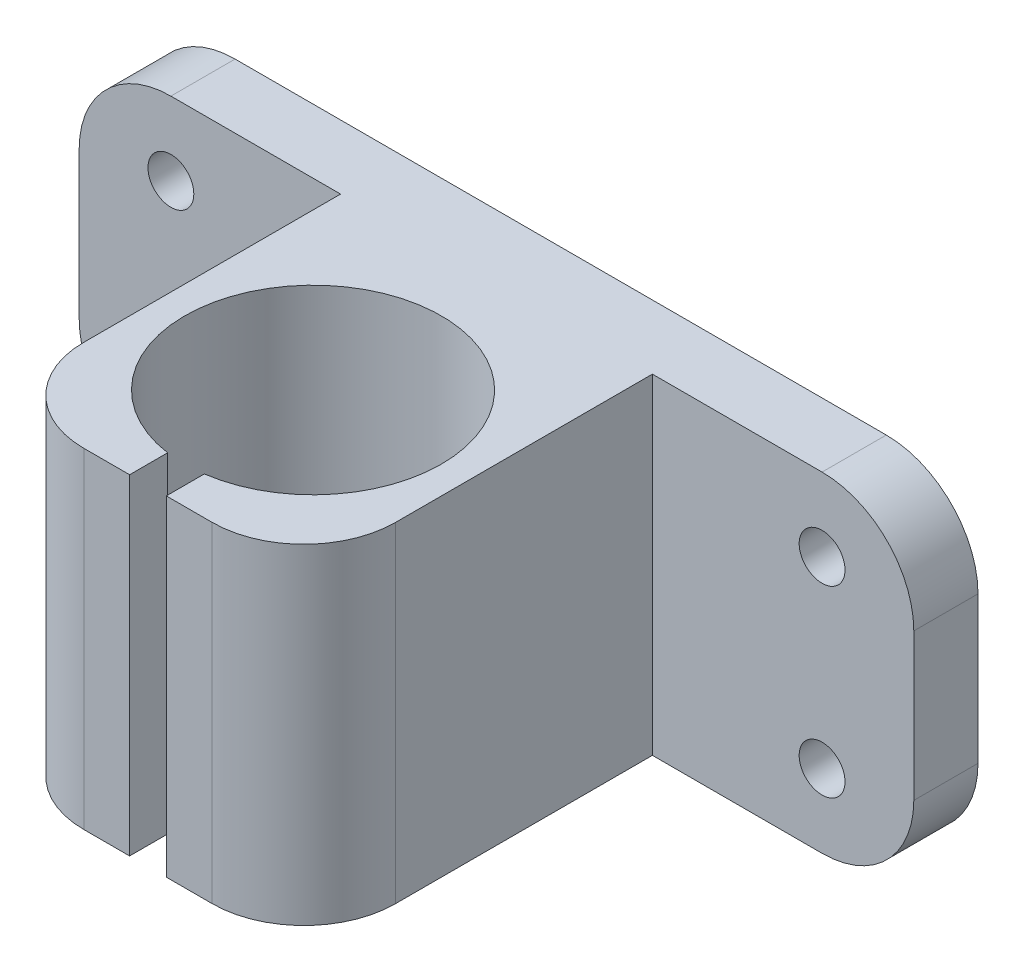
ISO-10303-21;
HEADER;
FILE_DESCRIPTION(('STEP AP214'),'2;1');
FILE_NAME('part.step','',(''),(''),'','','');
FILE_SCHEMA(('AUTOMOTIVE_DESIGN { 1 0 10303 214 1 1 1 1 }'));
ENDSEC;
DATA;
#1=APPLICATION_CONTEXT('core data for automotive mechanical design processes');
#2=APPLICATION_PROTOCOL_DEFINITION('international standard','automotive_design',2000,#1);
#3=PRODUCT_CONTEXT('',#1,'mechanical');
#4=PRODUCT('Part','Part','',(#3));
#5=PRODUCT_RELATED_PRODUCT_CATEGORY('part','',(#4));
#6=PRODUCT_DEFINITION_FORMATION('','',#4);
#7=PRODUCT_DEFINITION_CONTEXT('part definition',#1,'design');
#8=PRODUCT_DEFINITION('design','',#6,#7);
#9=PRODUCT_DEFINITION_SHAPE('','',#8);
#10=(LENGTH_UNIT() NAMED_UNIT(*) SI_UNIT(.MILLI.,.METRE.));
#11=(NAMED_UNIT(*) PLANE_ANGLE_UNIT() SI_UNIT($,.RADIAN.));
#12=(NAMED_UNIT(*) SI_UNIT($,.STERADIAN.) SOLID_ANGLE_UNIT());
#13=UNCERTAINTY_MEASURE_WITH_UNIT(LENGTH_MEASURE(1.E-05),#10,'distance_accuracy_value','');
#14=(GEOMETRIC_REPRESENTATION_CONTEXT(3) GLOBAL_UNCERTAINTY_ASSIGNED_CONTEXT((#13)) GLOBAL_UNIT_ASSIGNED_CONTEXT((#10,
#11,#12)) REPRESENTATION_CONTEXT('',''));
#15=CARTESIAN_POINT('',(0.,0.,0.));
#16=DIRECTION('',(0.,0.,1.));
#17=DIRECTION('',(1.,0.,0.));
#18=AXIS2_PLACEMENT_3D('',#15,#16,#17);
#19=CARTESIAN_POINT('',(0.,0.,45.));
#20=DIRECTION('',(0.,0.,1.));
#21=DIRECTION('',(1.,0.,0.));
#22=AXIS2_PLACEMENT_3D('',#19,#20,#21);
#23=PLANE('',#22);
#24=DIRECTION('',(-1.,0.,0.));
#25=VECTOR('',#24,1.);
#26=CARTESIAN_POINT('',(17.,18.,45.));
#27=LINE('',#26,#25);
#28=CARTESIAN_POINT('',(-2.,18.,45.));
#29=VERTEX_POINT('',#28);
#30=CARTESIAN_POINT('',(-7.,18.,45.));
#31=VERTEX_POINT('',#30);
#32=EDGE_CURVE('E171',#29,#31,#27,.T.);
#33=ORIENTED_EDGE('',*,*,#32,.T.);
#34=DIRECTION('',(0.,1.,0.));
#35=VECTOR('',#34,1.);
#36=CARTESIAN_POINT('',(-7.,0.,45.));
#37=LINE('',#36,#35);
#38=CARTESIAN_POINT('',(-7.,-18.,45.));
#39=VERTEX_POINT('',#38);
#40=EDGE_CURVE('E11',#31,#39,#37,.F.);
#41=ORIENTED_EDGE('',*,*,#40,.T.);
#42=DIRECTION('',(-1.,0.,0.));
#43=VECTOR('',#42,1.);
#44=CARTESIAN_POINT('',(17.,-18.,45.));
#45=LINE('',#44,#43);
#46=CARTESIAN_POINT('',(-2.,-18.,45.));
#47=VERTEX_POINT('',#46);
#48=EDGE_CURVE('E172',#47,#39,#45,.T.);
#49=ORIENTED_EDGE('',*,*,#48,.F.);
#50=DIRECTION('',(0.,1.,0.));
#51=VECTOR('',#50,1.);
#52=CARTESIAN_POINT('',(-2.,-18.,45.));
#53=LINE('',#52,#51);
#54=EDGE_CURVE('E160',#47,#29,#53,.T.);
#55=ORIENTED_EDGE('',*,*,#54,.T.);
#56=EDGE_LOOP('',(#33,#41,#49,#55));
#57=FACE_BOUND('',#56,.T.);
#58=ADVANCED_FACE('F33',(#57),#23,.T.);
#59=CARTESIAN_POINT('',(-35.5,7.99999999999998,7.));
#60=DIRECTION('',(0.,0.,1.));
#61=DIRECTION('',(1.,0.,0.));
#62=AXIS2_PLACEMENT_3D('',#59,#60,#61);
#63=PLANE('',#62);
#64=CARTESIAN_POINT('',(-35.5,-9.99999999999999,7.));
#65=DIRECTION('',(0.,0.,-1.));
#66=DIRECTION('',(-1.,0.,0.));
#67=AXIS2_PLACEMENT_3D('',#64,#65,#66);
#68=CIRCLE('',#67,2.5);
#69=CARTESIAN_POINT('',(-38.,-9.99999999999999,7.));
#70=VERTEX_POINT('',#69);
#71=EDGE_CURVE('E200',#70,#70,#68,.T.);
#72=ORIENTED_EDGE('',*,*,#71,.T.);
#73=EDGE_LOOP('',(#72));
#74=FACE_BOUND('',#73,.T.);
#75=CARTESIAN_POINT('',(-35.5,9.99999999999999,7.));
#76=DIRECTION('',(0.,0.,1.));
#77=DIRECTION('',(1.,0.,0.));
#78=AXIS2_PLACEMENT_3D('',#75,#76,#77);
#79=CIRCLE('',#78,2.5);
#80=CARTESIAN_POINT('',(-33.,9.99999999999999,7.));
#81=VERTEX_POINT('',#80);
#82=EDGE_CURVE('E204',#81,#81,#79,.T.);
#83=ORIENTED_EDGE('',*,*,#82,.F.);
#84=EDGE_LOOP('',(#83));
#85=FACE_BOUND('',#84,.T.);
#86=DIRECTION('',(-1.,0.,0.));
#87=VECTOR('',#86,1.);
#88=CARTESIAN_POINT('',(35.5,-18.,7.));
#89=LINE('',#88,#87);
#90=CARTESIAN_POINT('',(-17.,-18.,7.));
#91=VERTEX_POINT('',#90);
#92=CARTESIAN_POINT('',(-35.5,-18.,7.));
#93=VERTEX_POINT('',#92);
#94=EDGE_CURVE('E225',#91,#93,#89,.T.);
#95=ORIENTED_EDGE('',*,*,#94,.F.);
#96=DIRECTION('',(0.,1.,0.));
#97=VECTOR('',#96,1.);
#98=CARTESIAN_POINT('',(-17.,-18.,7.));
#99=LINE('',#98,#97);
#100=CARTESIAN_POINT('',(-17.,18.,7.));
#101=VERTEX_POINT('',#100);
#102=EDGE_CURVE('E179',#91,#101,#99,.T.);
#103=ORIENTED_EDGE('',*,*,#102,.T.);
#104=DIRECTION('',(-1.,0.,0.));
#105=VECTOR('',#104,1.);
#106=CARTESIAN_POINT('',(35.5,18.,7.));
#107=LINE('',#106,#105);
#108=CARTESIAN_POINT('',(-35.5,18.,7.));
#109=VERTEX_POINT('',#108);
#110=EDGE_CURVE('E217',#101,#109,#107,.T.);
#111=ORIENTED_EDGE('',*,*,#110,.T.);
#112=CARTESIAN_POINT('',(-35.5,7.99999999999998,7.));
#113=DIRECTION('',(0.,0.,1.));
#114=DIRECTION('',(1.,0.,0.));
#115=AXIS2_PLACEMENT_3D('',#112,#113,#114);
#116=CIRCLE('',#115,10.);
#117=CARTESIAN_POINT('',(-45.5,7.99999999999998,7.));
#118=VERTEX_POINT('',#117);
#119=EDGE_CURVE('E216',#109,#118,#116,.T.);
#120=ORIENTED_EDGE('',*,*,#119,.T.);
#121=DIRECTION('',(0.,1.,0.));
#122=VECTOR('',#121,1.);
#123=CARTESIAN_POINT('',(-45.5,-8.,7.));
#124=LINE('',#123,#122);
#125=CARTESIAN_POINT('',(-45.5,-8.,7.));
#126=VERTEX_POINT('',#125);
#127=EDGE_CURVE('E219',#126,#118,#124,.T.);
#128=ORIENTED_EDGE('',*,*,#127,.F.);
#129=CARTESIAN_POINT('',(-35.5,-8.,7.));
#130=DIRECTION('',(0.,0.,-1.));
#131=DIRECTION('',(-1.,0.,0.));
#132=AXIS2_PLACEMENT_3D('',#129,#130,#131);
#133=CIRCLE('',#132,10.);
#134=EDGE_CURVE('E222',#93,#126,#133,.T.);
#135=ORIENTED_EDGE('',*,*,#134,.F.);
#136=EDGE_LOOP('',(#95,#103,#111,#120,#128,#135));
#137=FACE_BOUND('',#136,.T.);
#138=ADVANCED_FACE('F315',(#74,#85,#137),#63,.T.);
#139=DIRECTION('',(0.,1.,0.));
#140=VECTOR('',#139,1.);
#141=CARTESIAN_POINT('',(17.,-18.,7.));
#142=LINE('',#141,#140);
#143=CARTESIAN_POINT('',(17.,-18.,7.));
#144=VERTEX_POINT('',#143);
#145=CARTESIAN_POINT('',(17.,18.,7.));
#146=VERTEX_POINT('',#145);
#147=EDGE_CURVE('E182',#144,#146,#142,.T.);
#148=ORIENTED_EDGE('',*,*,#147,.F.);
#149=CARTESIAN_POINT('',(35.5,-18.,7.));
#150=VERTEX_POINT('',#149);
#151=EDGE_CURVE('E226',#150,#144,#89,.T.);
#152=ORIENTED_EDGE('',*,*,#151,.F.);
#153=CARTESIAN_POINT('',(35.5,-7.99999999999999,7.));
#154=DIRECTION('',(0.,0.,1.));
#155=DIRECTION('',(1.,0.,0.));
#156=AXIS2_PLACEMENT_3D('',#153,#154,#155);
#157=CIRCLE('',#156,10.);
#158=CARTESIAN_POINT('',(45.5,-7.99999999999999,7.));
#159=VERTEX_POINT('',#158);
#160=EDGE_CURVE('E229',#150,#159,#157,.T.);
#161=ORIENTED_EDGE('',*,*,#160,.T.);
#162=DIRECTION('',(0.,1.,0.));
#163=VECTOR('',#162,1.);
#164=CARTESIAN_POINT('',(45.5,-7.99999999999999,7.));
#165=LINE('',#164,#163);
#166=CARTESIAN_POINT('',(45.5,7.99999999999999,7.));
#167=VERTEX_POINT('',#166);
#168=EDGE_CURVE('E231',#159,#167,#165,.T.);
#169=ORIENTED_EDGE('',*,*,#168,.T.);
#170=CARTESIAN_POINT('',(35.5,7.99999999999999,7.));
#171=DIRECTION('',(0.,0.,-1.));
#172=DIRECTION('',(-1.,0.,0.));
#173=AXIS2_PLACEMENT_3D('',#170,#171,#172);
#174=CIRCLE('',#173,10.);
#175=CARTESIAN_POINT('',(35.5,18.,7.));
#176=VERTEX_POINT('',#175);
#177=EDGE_CURVE('E233',#176,#167,#174,.T.);
#178=ORIENTED_EDGE('',*,*,#177,.F.);
#179=EDGE_CURVE('E213',#176,#146,#107,.T.);
#180=ORIENTED_EDGE('',*,*,#179,.T.);
#181=EDGE_LOOP('',(#148,#152,#161,#169,#178,#180));
#182=FACE_BOUND('',#181,.T.);
#183=CARTESIAN_POINT('',(35.5,10.,7.));
#184=DIRECTION('',(0.,0.,-1.));
#185=DIRECTION('',(-1.,0.,0.));
#186=AXIS2_PLACEMENT_3D('',#183,#184,#185);
#187=CIRCLE('',#186,2.5);
#188=CARTESIAN_POINT('',(33.,10.,7.));
#189=VERTEX_POINT('',#188);
#190=EDGE_CURVE('E201',#189,#189,#187,.T.);
#191=ORIENTED_EDGE('',*,*,#190,.T.);
#192=EDGE_LOOP('',(#191));
#193=FACE_BOUND('',#192,.T.);
#194=CARTESIAN_POINT('',(35.5,-10.,7.));
#195=DIRECTION('',(0.,0.,1.));
#196=DIRECTION('',(1.,0.,0.));
#197=AXIS2_PLACEMENT_3D('',#194,#195,#196);
#198=CIRCLE('',#197,2.5);
#199=CARTESIAN_POINT('',(38.,-10.,7.));
#200=VERTEX_POINT('',#199);
#201=EDGE_CURVE('E205',#200,#200,#198,.T.);
#202=ORIENTED_EDGE('',*,*,#201,.F.);
#203=EDGE_LOOP('',(#202));
#204=FACE_BOUND('',#203,.T.);
#205=ADVANCED_FACE('F348',(#182,#193,#204),#63,.T.);
#206=CARTESIAN_POINT('',(-35.5,7.99999999999998,0.));
#207=DIRECTION('',(0.,0.,1.));
#208=DIRECTION('',(1.,0.,0.));
#209=AXIS2_PLACEMENT_3D('',#206,#207,#208);
#210=PLANE('',#209);
#211=CARTESIAN_POINT('',(35.5,-10.,0.));
#212=DIRECTION('',(0.,0.,1.));
#213=DIRECTION('',(1.,0.,0.));
#214=AXIS2_PLACEMENT_3D('',#211,#212,#213);
#215=CIRCLE('',#214,2.5);
#216=CARTESIAN_POINT('',(38.,-10.,0.));
#217=VERTEX_POINT('',#216);
#218=EDGE_CURVE('E283',#217,#217,#215,.T.);
#219=ORIENTED_EDGE('',*,*,#218,.T.);
#220=EDGE_LOOP('',(#219));
#221=FACE_BOUND('',#220,.T.);
#222=CARTESIAN_POINT('',(-35.5,9.99999999999999,0.));
#223=DIRECTION('',(0.,0.,1.));
#224=DIRECTION('',(1.,0.,0.));
#225=AXIS2_PLACEMENT_3D('',#222,#223,#224);
#226=CIRCLE('',#225,2.5);
#227=CARTESIAN_POINT('',(-33.,9.99999999999999,0.));
#228=VERTEX_POINT('',#227);
#229=EDGE_CURVE('E212',#228,#228,#226,.T.);
#230=ORIENTED_EDGE('',*,*,#229,.T.);
#231=EDGE_LOOP('',(#230));
#232=FACE_BOUND('',#231,.T.);
#233=DIRECTION('',(-1.,0.,0.));
#234=VECTOR('',#233,1.);
#235=CARTESIAN_POINT('',(35.5,18.,0.));
#236=LINE('',#235,#234);
#237=CARTESIAN_POINT('',(35.5,18.,0.));
#238=VERTEX_POINT('',#237);
#239=CARTESIAN_POINT('',(-35.5,18.,0.));
#240=VERTEX_POINT('',#239);
#241=EDGE_CURVE('E237',#238,#240,#236,.T.);
#242=ORIENTED_EDGE('',*,*,#241,.F.);
#243=CARTESIAN_POINT('',(35.5,7.99999999999999,0.));
#244=DIRECTION('',(0.,0.,-1.));
#245=DIRECTION('',(-1.,0.,0.));
#246=AXIS2_PLACEMENT_3D('',#243,#244,#245);
#247=CIRCLE('',#246,10.);
#248=CARTESIAN_POINT('',(45.5,7.99999999999999,0.));
#249=VERTEX_POINT('',#248);
#250=EDGE_CURVE('E258',#238,#249,#247,.T.);
#251=ORIENTED_EDGE('',*,*,#250,.T.);
#252=DIRECTION('',(0.,1.,0.));
#253=VECTOR('',#252,1.);
#254=CARTESIAN_POINT('',(45.5,-7.99999999999999,0.));
#255=LINE('',#254,#253);
#256=CARTESIAN_POINT('',(45.5,-7.99999999999999,0.));
#257=VERTEX_POINT('',#256);
#258=EDGE_CURVE('E255',#257,#249,#255,.T.);
#259=ORIENTED_EDGE('',*,*,#258,.F.);
#260=CARTESIAN_POINT('',(35.5,-7.99999999999999,0.));
#261=DIRECTION('',(0.,0.,1.));
#262=DIRECTION('',(1.,0.,0.));
#263=AXIS2_PLACEMENT_3D('',#260,#261,#262);
#264=CIRCLE('',#263,10.);
#265=CARTESIAN_POINT('',(35.5,-18.,0.));
#266=VERTEX_POINT('',#265);
#267=EDGE_CURVE('E253',#266,#257,#264,.T.);
#268=ORIENTED_EDGE('',*,*,#267,.F.);
#269=DIRECTION('',(-1.,0.,0.));
#270=VECTOR('',#269,1.);
#271=CARTESIAN_POINT('',(35.5,-18.,0.));
#272=LINE('',#271,#270);
#273=CARTESIAN_POINT('',(-35.5,-18.,0.));
#274=VERTEX_POINT('',#273);
#275=EDGE_CURVE('E250',#266,#274,#272,.T.);
#276=ORIENTED_EDGE('',*,*,#275,.T.);
#277=CARTESIAN_POINT('',(-35.5,-8.,0.));
#278=DIRECTION('',(0.,0.,-1.));
#279=DIRECTION('',(-1.,0.,0.));
#280=AXIS2_PLACEMENT_3D('',#277,#278,#279);
#281=CIRCLE('',#280,10.);
#282=CARTESIAN_POINT('',(-45.5,-8.,0.));
#283=VERTEX_POINT('',#282);
#284=EDGE_CURVE('E247',#274,#283,#281,.T.);
#285=ORIENTED_EDGE('',*,*,#284,.T.);
#286=DIRECTION('',(0.,1.,0.));
#287=VECTOR('',#286,1.);
#288=CARTESIAN_POINT('',(-45.5,-8.,0.));
#289=LINE('',#288,#287);
#290=CARTESIAN_POINT('',(-45.5,7.99999999999998,0.));
#291=VERTEX_POINT('',#290);
#292=EDGE_CURVE('E244',#283,#291,#289,.T.);
#293=ORIENTED_EDGE('',*,*,#292,.T.);
#294=CARTESIAN_POINT('',(-35.5,7.99999999999998,0.));
#295=DIRECTION('',(0.,0.,1.));
#296=DIRECTION('',(1.,0.,0.));
#297=AXIS2_PLACEMENT_3D('',#294,#295,#296);
#298=CIRCLE('',#297,10.);
#299=EDGE_CURVE('E240',#240,#291,#298,.T.);
#300=ORIENTED_EDGE('',*,*,#299,.F.);
#301=EDGE_LOOP('',(#242,#251,#259,#268,#276,#285,#293,#300));
#302=FACE_BOUND('',#301,.T.);
#303=CARTESIAN_POINT('',(35.5,10.,0.));
#304=DIRECTION('',(0.,0.,1.));
#305=DIRECTION('',(1.,0.,0.));
#306=AXIS2_PLACEMENT_3D('',#303,#304,#305);
#307=CIRCLE('',#306,2.5);
#308=CARTESIAN_POINT('',(38.,10.,0.));
#309=VERTEX_POINT('',#308);
#310=EDGE_CURVE('E280',#309,#309,#307,.F.);
#311=ORIENTED_EDGE('',*,*,#310,.F.);
#312=EDGE_LOOP('',(#311));
#313=FACE_BOUND('',#312,.T.);
#314=CARTESIAN_POINT('',(-35.5,-9.99999999999999,0.));
#315=DIRECTION('',(0.,0.,1.));
#316=DIRECTION('',(1.,0.,0.));
#317=AXIS2_PLACEMENT_3D('',#314,#315,#316);
#318=CIRCLE('',#317,2.5);
#319=CARTESIAN_POINT('',(-33.,-9.99999999999999,0.));
#320=VERTEX_POINT('',#319);
#321=EDGE_CURVE('E241',#320,#320,#318,.F.);
#322=ORIENTED_EDGE('',*,*,#321,.F.);
#323=EDGE_LOOP('',(#322));
#324=FACE_BOUND('',#323,.T.);
#325=ADVANCED_FACE('F335',(#221,#232,#302,#313,#324),#210,.F.);
#326=CARTESIAN_POINT('',(35.5,18.,7.));
#327=DIRECTION('',(0.,-1.,0.));
#328=DIRECTION('',(1.,0.,0.));
#329=AXIS2_PLACEMENT_3D('',#326,#327,#328);
#330=PLANE('',#329);
#331=CARTESIAN_POINT('',(7.,18.,45.));
#332=VERTEX_POINT('',#331);
#333=CARTESIAN_POINT('',(2.,18.,45.));
#334=VERTEX_POINT('',#333);
#335=EDGE_CURVE('E178',#332,#334,#27,.T.);
#336=ORIENTED_EDGE('',*,*,#335,.F.);
#337=CARTESIAN_POINT('',(7.,18.,35.));
#338=DIRECTION('',(0.,-1.,0.));
#339=DIRECTION('',(1.,0.,0.));
#340=AXIS2_PLACEMENT_3D('',#337,#338,#339);
#341=CIRCLE('',#340,10.);
#342=CARTESIAN_POINT('',(17.,18.,35.));
#343=VERTEX_POINT('',#342);
#344=EDGE_CURVE('E298',#332,#343,#341,.F.);
#345=ORIENTED_EDGE('',*,*,#344,.T.);
#346=DIRECTION('',(0.,0.,-1.));
#347=VECTOR('',#346,1.);
#348=CARTESIAN_POINT('',(17.,18.,45.));
#349=LINE('',#348,#347);
#350=EDGE_CURVE('E198',#343,#146,#349,.T.);
#351=ORIENTED_EDGE('',*,*,#350,.T.);
#352=ORIENTED_EDGE('',*,*,#179,.F.);
#353=DIRECTION('',(0.,0.,-1.));
#354=VECTOR('',#353,1.);
#355=CARTESIAN_POINT('',(35.5,18.,7.));
#356=LINE('',#355,#354);
#357=EDGE_CURVE('E236',#176,#238,#356,.T.);
#358=ORIENTED_EDGE('',*,*,#357,.T.);
#359=ORIENTED_EDGE('',*,*,#241,.T.);
#360=DIRECTION('',(0.,0.,-1.));
#361=VECTOR('',#360,1.);
#362=CARTESIAN_POINT('',(-35.5,18.,7.));
#363=LINE('',#362,#361);
#364=EDGE_CURVE('E275',#109,#240,#363,.T.);
#365=ORIENTED_EDGE('',*,*,#364,.F.);
#366=ORIENTED_EDGE('',*,*,#110,.F.);
#367=DIRECTION('',(0.,0.,-1.));
#368=VECTOR('',#367,1.);
#369=CARTESIAN_POINT('',(-17.,18.,45.));
#370=LINE('',#369,#368);
#371=CARTESIAN_POINT('',(-17.,18.,35.));
#372=VERTEX_POINT('',#371);
#373=EDGE_CURVE('E196',#372,#101,#370,.T.);
#374=ORIENTED_EDGE('',*,*,#373,.F.);
#375=CARTESIAN_POINT('',(-7.,18.,35.));
#376=DIRECTION('',(0.,-1.,0.));
#377=DIRECTION('',(1.,0.,0.));
#378=AXIS2_PLACEMENT_3D('',#375,#376,#377);
#379=CIRCLE('',#378,10.);
#380=EDGE_CURVE('E177',#372,#31,#379,.F.);
#381=ORIENTED_EDGE('',*,*,#380,.T.);
#382=ORIENTED_EDGE('',*,*,#32,.F.);
#383=DIRECTION('',(0.,0.,1.));
#384=VECTOR('',#383,1.);
#385=CARTESIAN_POINT('',(-2.,18.,35.));
#386=LINE('',#385,#384);
#387=CARTESIAN_POINT('',(-2.,18.,40.856406460551));
#388=VERTEX_POINT('',#387);
#389=EDGE_CURVE('E157',#388,#29,#386,.T.);
#390=ORIENTED_EDGE('',*,*,#389,.F.);
#391=CARTESIAN_POINT('',(0.,18.,27.));
#392=DIRECTION('',(0.,1.,0.));
#393=DIRECTION('',(-1.,0.,0.));
#394=AXIS2_PLACEMENT_3D('',#391,#392,#393);
#395=CIRCLE('',#394,14.);
#396=CARTESIAN_POINT('',(2.,18.,40.856406460551));
#397=VERTEX_POINT('',#396);
#398=EDGE_CURVE('E186',#397,#388,#395,.T.);
#399=ORIENTED_EDGE('',*,*,#398,.F.);
#400=DIRECTION('',(0.,0.,1.));
#401=VECTOR('',#400,1.);
#402=CARTESIAN_POINT('',(2.,18.,35.));
#403=LINE('',#402,#401);
#404=EDGE_CURVE('E364',#397,#334,#403,.T.);
#405=ORIENTED_EDGE('',*,*,#404,.T.);
#406=EDGE_LOOP('',(#336,#345,#351,#352,#358,#359,#365,#366,#374,#381,#382,#390,#399,#405));
#407=FACE_BOUND('',#406,.T.);
#408=ADVANCED_FACE('F175',(#407),#330,.F.);
#409=CARTESIAN_POINT('',(-35.5,7.99999999999998,7.));
#410=DIRECTION('',(0.,0.,-1.));
#411=DIRECTION('',(-1.,0.,0.));
#412=AXIS2_PLACEMENT_3D('',#409,#410,#411);
#413=CYLINDRICAL_SURFACE('',#412,10.);
#414=ORIENTED_EDGE('',*,*,#299,.T.);
#415=DIRECTION('',(0.,0.,-1.));
#416=VECTOR('',#415,1.);
#417=CARTESIAN_POINT('',(-45.5,7.99999999999998,7.));
#418=LINE('',#417,#416);
#419=EDGE_CURVE('E273',#118,#291,#418,.T.);
#420=ORIENTED_EDGE('',*,*,#419,.F.);
#421=ORIENTED_EDGE('',*,*,#119,.F.);
#422=ORIENTED_EDGE('',*,*,#364,.T.);
#423=EDGE_LOOP('',(#414,#420,#421,#422));
#424=FACE_BOUND('',#423,.T.);
#425=ADVANCED_FACE('F319',(#424),#413,.T.);
#426=CARTESIAN_POINT('',(-45.5,-8.,7.));
#427=DIRECTION('',(-1.,0.,0.));
#428=DIRECTION('',(0.,-1.,0.));
#429=AXIS2_PLACEMENT_3D('',#426,#427,#428);
#430=PLANE('',#429);
#431=ORIENTED_EDGE('',*,*,#292,.F.);
#432=DIRECTION('',(0.,0.,-1.));
#433=VECTOR('',#432,1.);
#434=CARTESIAN_POINT('',(-45.5,-8.,7.));
#435=LINE('',#434,#433);
#436=EDGE_CURVE('E271',#126,#283,#435,.T.);
#437=ORIENTED_EDGE('',*,*,#436,.F.);
#438=ORIENTED_EDGE('',*,*,#127,.T.);
#439=ORIENTED_EDGE('',*,*,#419,.T.);
#440=EDGE_LOOP('',(#431,#437,#438,#439));
#441=FACE_BOUND('',#440,.T.);
#442=ADVANCED_FACE('F322',(#441),#430,.T.);
#443=CARTESIAN_POINT('',(-35.5,-8.,7.));
#444=DIRECTION('',(0.,0.,-1.));
#445=DIRECTION('',(-1.,0.,0.));
#446=AXIS2_PLACEMENT_3D('',#443,#444,#445);
#447=CYLINDRICAL_SURFACE('',#446,10.);
#448=ORIENTED_EDGE('',*,*,#284,.F.);
#449=DIRECTION('',(0.,0.,-1.));
#450=VECTOR('',#449,1.);
#451=CARTESIAN_POINT('',(-35.5,-18.,7.));
#452=LINE('',#451,#450);
#453=EDGE_CURVE('E269',#93,#274,#452,.T.);
#454=ORIENTED_EDGE('',*,*,#453,.F.);
#455=ORIENTED_EDGE('',*,*,#134,.T.);
#456=ORIENTED_EDGE('',*,*,#436,.T.);
#457=EDGE_LOOP('',(#448,#454,#455,#456));
#458=FACE_BOUND('',#457,.T.);
#459=ADVANCED_FACE('F327',(#458),#447,.T.);
#460=CARTESIAN_POINT('',(35.5,-18.,7.));
#461=DIRECTION('',(0.,-1.,0.));
#462=DIRECTION('',(1.,0.,0.));
#463=AXIS2_PLACEMENT_3D('',#460,#461,#462);
#464=PLANE('',#463);
#465=DIRECTION('',(0.,0.,-1.));
#466=VECTOR('',#465,1.);
#467=CARTESIAN_POINT('',(17.,-18.,45.));
#468=LINE('',#467,#466);
#469=CARTESIAN_POINT('',(17.,-18.,35.));
#470=VERTEX_POINT('',#469);
#471=EDGE_CURVE('E189',#470,#144,#468,.T.);
#472=ORIENTED_EDGE('',*,*,#471,.F.);
#473=CARTESIAN_POINT('',(7.,-18.,35.));
#474=DIRECTION('',(0.,-1.,0.));
#475=DIRECTION('',(1.,0.,0.));
#476=AXIS2_PLACEMENT_3D('',#473,#474,#475);
#477=CIRCLE('',#476,10.);
#478=CARTESIAN_POINT('',(7.,-18.,45.));
#479=VERTEX_POINT('',#478);
#480=EDGE_CURVE('E303',#470,#479,#477,.T.);
#481=ORIENTED_EDGE('',*,*,#480,.T.);
#482=CARTESIAN_POINT('',(2.,-18.,45.));
#483=VERTEX_POINT('',#482);
#484=EDGE_CURVE('E187',#479,#483,#45,.T.);
#485=ORIENTED_EDGE('',*,*,#484,.T.);
#486=DIRECTION('',(0.,0.,1.));
#487=VECTOR('',#486,1.);
#488=CARTESIAN_POINT('',(2.,-18.,35.));
#489=LINE('',#488,#487);
#490=CARTESIAN_POINT('',(2.,-18.,40.856406460551));
#491=VERTEX_POINT('',#490);
#492=EDGE_CURVE('E366',#491,#483,#489,.T.);
#493=ORIENTED_EDGE('',*,*,#492,.F.);
#494=CARTESIAN_POINT('',(0.,-18.,27.));
#495=DIRECTION('',(0.,-1.,0.));
#496=DIRECTION('',(1.,0.,0.));
#497=AXIS2_PLACEMENT_3D('',#494,#495,#496);
#498=CIRCLE('',#497,14.);
#499=CARTESIAN_POINT('',(-2.,-18.,40.856406460551));
#500=VERTEX_POINT('',#499);
#501=EDGE_CURVE('E191',#500,#491,#498,.T.);
#502=ORIENTED_EDGE('',*,*,#501,.F.);
#503=DIRECTION('',(0.,0.,1.));
#504=VECTOR('',#503,1.);
#505=CARTESIAN_POINT('',(-2.,-18.,35.));
#506=LINE('',#505,#504);
#507=EDGE_CURVE('E168',#500,#47,#506,.T.);
#508=ORIENTED_EDGE('',*,*,#507,.T.);
#509=ORIENTED_EDGE('',*,*,#48,.T.);
#510=CARTESIAN_POINT('',(-7.,-18.,35.));
#511=DIRECTION('',(0.,-1.,0.));
#512=DIRECTION('',(1.,0.,0.));
#513=AXIS2_PLACEMENT_3D('',#510,#511,#512);
#514=CIRCLE('',#513,10.);
#515=CARTESIAN_POINT('',(-17.,-18.,35.));
#516=VERTEX_POINT('',#515);
#517=EDGE_CURVE('E48',#39,#516,#514,.T.);
#518=ORIENTED_EDGE('',*,*,#517,.T.);
#519=DIRECTION('',(0.,0.,-1.));
#520=VECTOR('',#519,1.);
#521=CARTESIAN_POINT('',(-17.,-18.,45.));
#522=LINE('',#521,#520);
#523=EDGE_CURVE('E194',#516,#91,#522,.T.);
#524=ORIENTED_EDGE('',*,*,#523,.T.);
#525=ORIENTED_EDGE('',*,*,#94,.T.);
#526=ORIENTED_EDGE('',*,*,#453,.T.);
#527=ORIENTED_EDGE('',*,*,#275,.F.);
#528=DIRECTION('',(0.,0.,-1.));
#529=VECTOR('',#528,1.);
#530=CARTESIAN_POINT('',(35.5,-18.,7.));
#531=LINE('',#530,#529);
#532=EDGE_CURVE('E267',#150,#266,#531,.T.);
#533=ORIENTED_EDGE('',*,*,#532,.F.);
#534=ORIENTED_EDGE('',*,*,#151,.T.);
#535=EDGE_LOOP('',(#472,#481,#485,#493,#502,#508,#509,#518,#524,#525,#526,#527,#533,#534));
#536=FACE_BOUND('',#535,.T.);
#537=ADVANCED_FACE('F330',(#536),#464,.T.);
#538=CARTESIAN_POINT('',(35.5,-7.99999999999999,7.));
#539=DIRECTION('',(0.,0.,-1.));
#540=DIRECTION('',(-1.,0.,0.));
#541=AXIS2_PLACEMENT_3D('',#538,#539,#540);
#542=CYLINDRICAL_SURFACE('',#541,10.);
#543=ORIENTED_EDGE('',*,*,#267,.T.);
#544=DIRECTION('',(0.,0.,-1.));
#545=VECTOR('',#544,1.);
#546=CARTESIAN_POINT('',(45.5,-7.99999999999999,7.));
#547=LINE('',#546,#545);
#548=EDGE_CURVE('E264',#159,#257,#547,.T.);
#549=ORIENTED_EDGE('',*,*,#548,.F.);
#550=ORIENTED_EDGE('',*,*,#160,.F.);
#551=ORIENTED_EDGE('',*,*,#532,.T.);
#552=EDGE_LOOP('',(#543,#549,#550,#551));
#553=FACE_BOUND('',#552,.T.);
#554=ADVANCED_FACE('F340',(#553),#542,.T.);
#555=CARTESIAN_POINT('',(45.5,-7.99999999999999,7.));
#556=DIRECTION('',(-1.,0.,0.));
#557=DIRECTION('',(0.,0.,1.));
#558=AXIS2_PLACEMENT_3D('',#555,#556,#557);
#559=PLANE('',#558);
#560=ORIENTED_EDGE('',*,*,#258,.T.);
#561=DIRECTION('',(0.,0.,-1.));
#562=VECTOR('',#561,1.);
#563=CARTESIAN_POINT('',(45.5,7.99999999999999,7.));
#564=LINE('',#563,#562);
#565=EDGE_CURVE('E262',#167,#249,#564,.T.);
#566=ORIENTED_EDGE('',*,*,#565,.F.);
#567=ORIENTED_EDGE('',*,*,#168,.F.);
#568=ORIENTED_EDGE('',*,*,#548,.T.);
#569=EDGE_LOOP('',(#560,#566,#567,#568));
#570=FACE_BOUND('',#569,.T.);
#571=ADVANCED_FACE('F343',(#570),#559,.F.);
#572=CARTESIAN_POINT('',(35.5,7.99999999999999,7.));
#573=DIRECTION('',(0.,0.,-1.));
#574=DIRECTION('',(-1.,0.,0.));
#575=AXIS2_PLACEMENT_3D('',#572,#573,#574);
#576=CYLINDRICAL_SURFACE('',#575,10.);
#577=ORIENTED_EDGE('',*,*,#250,.F.);
#578=ORIENTED_EDGE('',*,*,#357,.F.);
#579=ORIENTED_EDGE('',*,*,#177,.T.);
#580=ORIENTED_EDGE('',*,*,#565,.T.);
#581=EDGE_LOOP('',(#577,#578,#579,#580));
#582=FACE_BOUND('',#581,.T.);
#583=ADVANCED_FACE('F418',(#582),#576,.T.);
#584=CARTESIAN_POINT('',(-35.5,9.99999999999999,-3.));
#585=DIRECTION('',(0.,0.,1.));
#586=DIRECTION('',(1.,0.,0.));
#587=AXIS2_PLACEMENT_3D('',#584,#585,#586);
#588=CYLINDRICAL_SURFACE('',#587,2.5);
#589=ORIENTED_EDGE('',*,*,#82,.T.);
#590=EDGE_LOOP('',(#589));
#591=FACE_BOUND('',#590,.T.);
#592=ORIENTED_EDGE('',*,*,#229,.F.);
#593=EDGE_LOOP('',(#592));
#594=FACE_BOUND('',#593,.T.);
#595=ADVANCED_FACE('F409',(#591,#594),#588,.F.);
#596=CARTESIAN_POINT('',(35.5,10.,-3.));
#597=DIRECTION('',(0.,0.,1.));
#598=DIRECTION('',(1.,0.,0.));
#599=AXIS2_PLACEMENT_3D('',#596,#597,#598);
#600=CYLINDRICAL_SURFACE('',#599,2.5);
#601=ORIENTED_EDGE('',*,*,#190,.F.);
#602=EDGE_LOOP('',(#601));
#603=FACE_BOUND('',#602,.T.);
#604=ORIENTED_EDGE('',*,*,#310,.T.);
#605=EDGE_LOOP('',(#604));
#606=FACE_BOUND('',#605,.T.);
#607=ADVANCED_FACE('F405',(#603,#606),#600,.F.);
#608=CARTESIAN_POINT('',(35.5,-10.,-3.));
#609=DIRECTION('',(0.,0.,1.));
#610=DIRECTION('',(1.,0.,0.));
#611=AXIS2_PLACEMENT_3D('',#608,#609,#610);
#612=CYLINDRICAL_SURFACE('',#611,2.5);
#613=ORIENTED_EDGE('',*,*,#201,.T.);
#614=EDGE_LOOP('',(#613));
#615=FACE_BOUND('',#614,.T.);
#616=ORIENTED_EDGE('',*,*,#218,.F.);
#617=EDGE_LOOP('',(#616));
#618=FACE_BOUND('',#617,.T.);
#619=ADVANCED_FACE('F408',(#615,#618),#612,.F.);
#620=CARTESIAN_POINT('',(-35.5,-9.99999999999999,-3.));
#621=DIRECTION('',(0.,0.,1.));
#622=DIRECTION('',(1.,0.,0.));
#623=AXIS2_PLACEMENT_3D('',#620,#621,#622);
#624=CYLINDRICAL_SURFACE('',#623,2.5);
#625=ORIENTED_EDGE('',*,*,#71,.F.);
#626=EDGE_LOOP('',(#625));
#627=FACE_BOUND('',#626,.T.);
#628=ORIENTED_EDGE('',*,*,#321,.T.);
#629=EDGE_LOOP('',(#628));
#630=FACE_BOUND('',#629,.T.);
#631=ADVANCED_FACE('F402',(#627,#630),#624,.F.);
#632=CARTESIAN_POINT('',(17.,-18.,45.));
#633=DIRECTION('',(-1.,0.,0.));
#634=DIRECTION('',(0.,0.,1.));
#635=AXIS2_PLACEMENT_3D('',#632,#633,#634);
#636=PLANE('',#635);
#637=ORIENTED_EDGE('',*,*,#350,.F.);
#638=DIRECTION('',(0.,1.,0.));
#639=VECTOR('',#638,1.);
#640=CARTESIAN_POINT('',(17.,-18.,35.));
#641=LINE('',#640,#639);
#642=EDGE_CURVE('E300',#343,#470,#641,.F.);
#643=ORIENTED_EDGE('',*,*,#642,.T.);
#644=ORIENTED_EDGE('',*,*,#471,.T.);
#645=ORIENTED_EDGE('',*,*,#147,.T.);
#646=EDGE_LOOP('',(#637,#643,#644,#645));
#647=FACE_BOUND('',#646,.T.);
#648=ADVANCED_FACE('F398',(#647),#636,.F.);
#649=CARTESIAN_POINT('',(-17.,-18.,45.));
#650=DIRECTION('',(-1.,0.,0.));
#651=DIRECTION('',(0.,0.,1.));
#652=AXIS2_PLACEMENT_3D('',#649,#650,#651);
#653=PLANE('',#652);
#654=ORIENTED_EDGE('',*,*,#523,.F.);
#655=DIRECTION('',(0.,1.,0.));
#656=VECTOR('',#655,1.);
#657=CARTESIAN_POINT('',(-17.,-18.,35.));
#658=LINE('',#657,#656);
#659=EDGE_CURVE('E41',#516,#372,#658,.T.);
#660=ORIENTED_EDGE('',*,*,#659,.T.);
#661=ORIENTED_EDGE('',*,*,#373,.T.);
#662=ORIENTED_EDGE('',*,*,#102,.F.);
#663=EDGE_LOOP('',(#654,#660,#661,#662));
#664=FACE_BOUND('',#663,.T.);
#665=ADVANCED_FACE('F307',(#664),#653,.T.);
#666=ORIENTED_EDGE('',*,*,#484,.F.);
#667=DIRECTION('',(0.,1.,0.));
#668=VECTOR('',#667,1.);
#669=CARTESIAN_POINT('',(7.,18.,45.));
#670=LINE('',#669,#668);
#671=EDGE_CURVE('E294',#479,#332,#670,.T.);
#672=ORIENTED_EDGE('',*,*,#671,.T.);
#673=ORIENTED_EDGE('',*,*,#335,.T.);
#674=DIRECTION('',(0.,1.,0.));
#675=VECTOR('',#674,1.);
#676=CARTESIAN_POINT('',(2.,-18.,45.));
#677=LINE('',#676,#675);
#678=EDGE_CURVE('E169',#483,#334,#677,.T.);
#679=ORIENTED_EDGE('',*,*,#678,.F.);
#680=EDGE_LOOP('',(#666,#672,#673,#679));
#681=FACE_BOUND('',#680,.T.);
#682=ADVANCED_FACE('F359',(#681),#23,.T.);
#683=CARTESIAN_POINT('',(0.,-22.,27.));
#684=DIRECTION('',(0.,1.,0.));
#685=DIRECTION('',(-1.,0.,0.));
#686=AXIS2_PLACEMENT_3D('',#683,#684,#685);
#687=CYLINDRICAL_SURFACE('',#686,14.);
#688=ORIENTED_EDGE('',*,*,#501,.T.);
#689=DIRECTION('',(0.,1.,0.));
#690=VECTOR('',#689,1.);
#691=CARTESIAN_POINT('',(2.,-22.,40.856406460551));
#692=LINE('',#691,#690);
#693=EDGE_CURVE('E291',#491,#397,#692,.T.);
#694=ORIENTED_EDGE('',*,*,#693,.T.);
#695=ORIENTED_EDGE('',*,*,#398,.T.);
#696=DIRECTION('',(0.,1.,0.));
#697=VECTOR('',#696,1.);
#698=CARTESIAN_POINT('',(-2.,-22.,40.856406460551));
#699=LINE('',#698,#697);
#700=EDGE_CURVE('E163',#500,#388,#699,.T.);
#701=ORIENTED_EDGE('',*,*,#700,.F.);
#702=EDGE_LOOP('',(#688,#694,#695,#701));
#703=FACE_BOUND('',#702,.T.);
#704=ADVANCED_FACE('F375',(#703),#687,.F.);
#705=CARTESIAN_POINT('',(-2.,-18.,35.));
#706=DIRECTION('',(1.,0.,0.));
#707=DIRECTION('',(0.,0.,-1.));
#708=AXIS2_PLACEMENT_3D('',#705,#706,#707);
#709=PLANE('',#708);
#710=ORIENTED_EDGE('',*,*,#700,.T.);
#711=ORIENTED_EDGE('',*,*,#389,.T.);
#712=ORIENTED_EDGE('',*,*,#54,.F.);
#713=ORIENTED_EDGE('',*,*,#507,.F.);
#714=EDGE_LOOP('',(#710,#711,#712,#713));
#715=FACE_BOUND('',#714,.T.);
#716=ADVANCED_FACE('F159',(#715),#709,.T.);
#717=CARTESIAN_POINT('',(2.,-18.,35.));
#718=DIRECTION('',(1.,0.,0.));
#719=DIRECTION('',(0.,0.,-1.));
#720=AXIS2_PLACEMENT_3D('',#717,#718,#719);
#721=PLANE('',#720);
#722=ORIENTED_EDGE('',*,*,#492,.T.);
#723=ORIENTED_EDGE('',*,*,#678,.T.);
#724=ORIENTED_EDGE('',*,*,#404,.F.);
#725=ORIENTED_EDGE('',*,*,#693,.F.);
#726=EDGE_LOOP('',(#722,#723,#724,#725));
#727=FACE_BOUND('',#726,.T.);
#728=ADVANCED_FACE('F376',(#727),#721,.F.);
#729=CARTESIAN_POINT('',(7.,0.,35.));
#730=DIRECTION('',(0.,-1.,0.));
#731=DIRECTION('',(0.,0.,-1.));
#732=AXIS2_PLACEMENT_3D('',#729,#730,#731);
#733=CYLINDRICAL_SURFACE('',#732,10.);
#734=ORIENTED_EDGE('',*,*,#480,.F.);
#735=ORIENTED_EDGE('',*,*,#642,.F.);
#736=ORIENTED_EDGE('',*,*,#344,.F.);
#737=ORIENTED_EDGE('',*,*,#671,.F.);
#738=EDGE_LOOP('',(#734,#735,#736,#737));
#739=FACE_BOUND('',#738,.T.);
#740=ADVANCED_FACE('F357',(#739),#733,.T.);
#741=CARTESIAN_POINT('',(-7.,-18.,35.));
#742=DIRECTION('',(0.,1.,0.));
#743=DIRECTION('',(0.,0.,1.));
#744=AXIS2_PLACEMENT_3D('',#741,#742,#743);
#745=CYLINDRICAL_SURFACE('',#744,10.);
#746=ORIENTED_EDGE('',*,*,#517,.F.);
#747=ORIENTED_EDGE('',*,*,#40,.F.);
#748=ORIENTED_EDGE('',*,*,#380,.F.);
#749=ORIENTED_EDGE('',*,*,#659,.F.);
#750=EDGE_LOOP('',(#746,#747,#748,#749));
#751=FACE_BOUND('',#750,.T.);
#752=ADVANCED_FACE('F35',(#751),#745,.T.);
#753=CLOSED_SHELL('',(#58,#138,#205,#325,#408,#425,#442,#459,#537,#554,#571,#583,#595,#607,#619,
#631,#648,#665,#682,#704,#716,#728,#740,#752));
#754=MANIFOLD_SOLID_BREP('B2',#753);
#755=ADVANCED_BREP_SHAPE_REPRESENTATION('',(#18,#754),#14);
#756=SHAPE_DEFINITION_REPRESENTATION(#9,#755);
ENDSEC;
END-ISO-10303-21;
